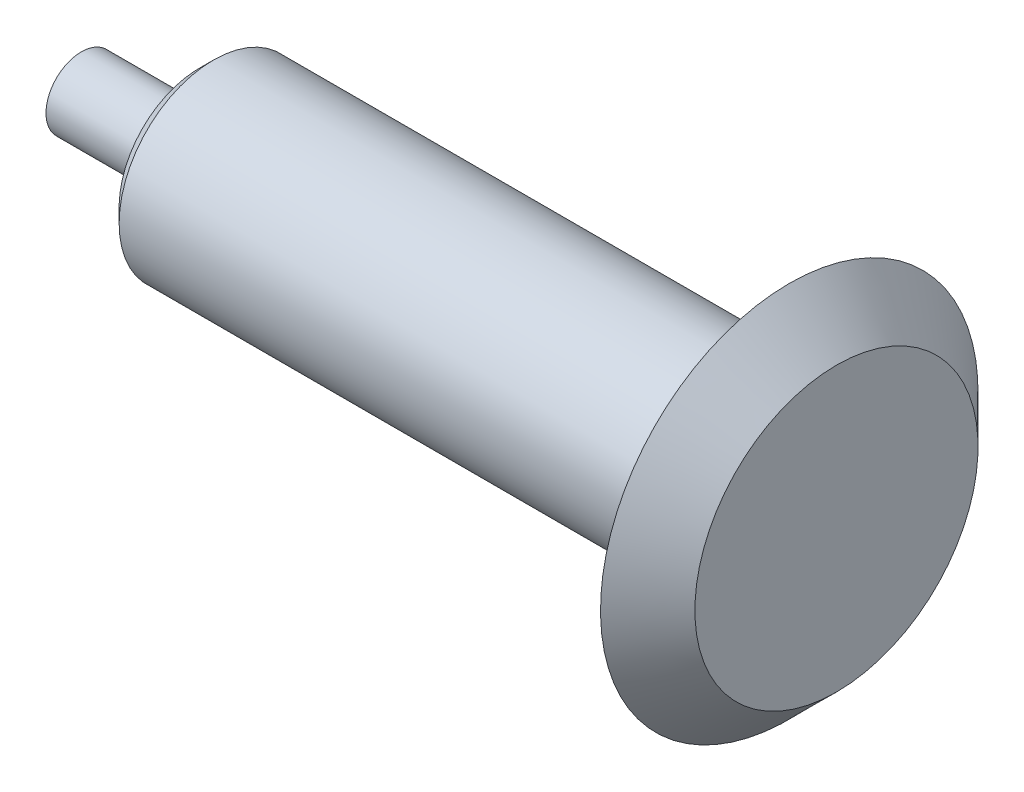
ISO-10303-21;
HEADER;
FILE_DESCRIPTION(('STEP AP214'),'2;1');
FILE_NAME('part.step','',(''),(''),'','','');
FILE_SCHEMA(('AUTOMOTIVE_DESIGN { 1 0 10303 214 1 1 1 1 }'));
ENDSEC;
DATA;
#1=APPLICATION_CONTEXT('core data for automotive mechanical design processes');
#2=APPLICATION_PROTOCOL_DEFINITION('international standard','automotive_design',2000,#1);
#3=PRODUCT_CONTEXT('',#1,'mechanical');
#4=PRODUCT('Part','Part','',(#3));
#5=PRODUCT_RELATED_PRODUCT_CATEGORY('part','',(#4));
#6=PRODUCT_DEFINITION_FORMATION('','',#4);
#7=PRODUCT_DEFINITION_CONTEXT('part definition',#1,'design');
#8=PRODUCT_DEFINITION('design','',#6,#7);
#9=PRODUCT_DEFINITION_SHAPE('','',#8);
#10=(LENGTH_UNIT() NAMED_UNIT(*) SI_UNIT(.MILLI.,.METRE.));
#11=(NAMED_UNIT(*) PLANE_ANGLE_UNIT() SI_UNIT($,.RADIAN.));
#12=(NAMED_UNIT(*) SI_UNIT($,.STERADIAN.) SOLID_ANGLE_UNIT());
#13=UNCERTAINTY_MEASURE_WITH_UNIT(LENGTH_MEASURE(1.E-05),#10,'distance_accuracy_value','');
#14=(GEOMETRIC_REPRESENTATION_CONTEXT(3) GLOBAL_UNCERTAINTY_ASSIGNED_CONTEXT((#13)) GLOBAL_UNIT_ASSIGNED_CONTEXT((#10,
#11,#12)) REPRESENTATION_CONTEXT('',''));
#15=CARTESIAN_POINT('',(0.,0.,0.));
#16=DIRECTION('',(0.,0.,1.));
#17=DIRECTION('',(1.,0.,0.));
#18=AXIS2_PLACEMENT_3D('',#15,#16,#17);
#19=CARTESIAN_POINT('',(-80.,0.,0.));
#20=DIRECTION('',(-1.,0.,0.));
#21=DIRECTION('',(0.,-1.,0.));
#22=AXIS2_PLACEMENT_3D('',#19,#20,#21);
#23=PLANE('',#22);
#24=CARTESIAN_POINT('',(-80.,0.,0.));
#25=DIRECTION('',(1.,0.,0.));
#26=DIRECTION('',(0.,1.,0.));
#27=AXIS2_PLACEMENT_3D('',#24,#25,#26);
#28=CIRCLE('',#27,7.5);
#29=CARTESIAN_POINT('',(-80.,7.49999999999998,0.));
#30=VERTEX_POINT('',#29);
#31=EDGE_CURVE('E53',#30,#30,#28,.T.);
#32=ORIENTED_EDGE('',*,*,#31,.F.);
#33=EDGE_LOOP('',(#32));
#34=FACE_BOUND('',#33,.T.);
#35=ADVANCED_FACE('F37',(#34),#23,.T.);
#36=CARTESIAN_POINT('',(80.,0.,0.));
#37=DIRECTION('',(1.,0.,0.));
#38=DIRECTION('',(0.,1.,0.));
#39=AXIS2_PLACEMENT_3D('',#36,#37,#38);
#40=CYLINDRICAL_SURFACE('',#39,7.5);
#41=ORIENTED_EDGE('',*,*,#31,.T.);
#42=EDGE_LOOP('',(#41));
#43=FACE_BOUND('',#42,.T.);
#44=CARTESIAN_POINT('',(-55.,0.,0.));
#45=DIRECTION('',(1.,0.,0.));
#46=DIRECTION('',(0.,1.,0.));
#47=AXIS2_PLACEMENT_3D('',#44,#45,#46);
#48=CIRCLE('',#47,7.49999999999999);
#49=CARTESIAN_POINT('',(-55.,7.49999999999998,0.));
#50=VERTEX_POINT('',#49);
#51=EDGE_CURVE('E58',#50,#50,#48,.T.);
#52=ORIENTED_EDGE('',*,*,#51,.F.);
#53=EDGE_LOOP('',(#52));
#54=FACE_BOUND('',#53,.T.);
#55=ADVANCED_FACE('F90',(#43,#54),#40,.T.);
#56=CARTESIAN_POINT('',(-55.,7.49999999999998,0.));
#57=DIRECTION('',(-1.,0.,0.));
#58=DIRECTION('',(0.,-1.,0.));
#59=AXIS2_PLACEMENT_3D('',#56,#57,#58);
#60=PLANE('',#59);
#61=CARTESIAN_POINT('',(-55.,0.,0.));
#62=DIRECTION('',(-1.,0.,0.));
#63=DIRECTION('',(0.,-1.,0.));
#64=AXIS2_PLACEMENT_3D('',#61,#62,#63);
#65=CIRCLE('',#64,16.9999999999999);
#66=CARTESIAN_POINT('',(-55.,-17.,0.));
#67=VERTEX_POINT('',#66);
#68=EDGE_CURVE('E10',#67,#67,#65,.T.);
#69=ORIENTED_EDGE('',*,*,#68,.T.);
#70=EDGE_LOOP('',(#69));
#71=FACE_BOUND('',#70,.T.);
#72=ORIENTED_EDGE('',*,*,#51,.T.);
#73=EDGE_LOOP('',(#72));
#74=FACE_BOUND('',#73,.T.);
#75=ADVANCED_FACE('F96',(#71,#74),#60,.T.);
#76=CARTESIAN_POINT('',(80.,0.,0.));
#77=DIRECTION('',(1.,0.,0.));
#78=DIRECTION('',(0.,1.,0.));
#79=AXIS2_PLACEMENT_3D('',#76,#77,#78);
#80=CYLINDRICAL_SURFACE('',#79,20.);
#81=CARTESIAN_POINT('',(-52.,0.,0.));
#82=DIRECTION('',(-1.,0.,0.));
#83=DIRECTION('',(0.,-1.,0.));
#84=AXIS2_PLACEMENT_3D('',#81,#82,#83);
#85=CIRCLE('',#84,20.);
#86=CARTESIAN_POINT('',(-52.,-20.,0.));
#87=VERTEX_POINT('',#86);
#88=EDGE_CURVE('E45',#87,#87,#85,.F.);
#89=ORIENTED_EDGE('',*,*,#88,.T.);
#90=EDGE_LOOP('',(#89));
#91=FACE_BOUND('',#90,.T.);
#92=CARTESIAN_POINT('',(62.9289321881345,0.,0.));
#93=DIRECTION('',(1.,0.,0.));
#94=DIRECTION('',(0.,1.,0.));
#95=AXIS2_PLACEMENT_3D('',#92,#93,#94);
#96=CIRCLE('',#95,20.);
#97=CARTESIAN_POINT('',(62.9289321881345,20.,0.));
#98=VERTEX_POINT('',#97);
#99=EDGE_CURVE('E61',#98,#98,#96,.T.);
#100=ORIENTED_EDGE('',*,*,#99,.F.);
#101=EDGE_LOOP('',(#100));
#102=FACE_BOUND('',#101,.T.);
#103=ADVANCED_FACE('F86',(#91,#102),#80,.T.);
#104=CARTESIAN_POINT('',(70.,0.,0.));
#105=DIRECTION('',(1.,0.,0.));
#106=DIRECTION('',(0.,1.,0.));
#107=AXIS2_PLACEMENT_3D('',#104,#105,#106);
#108=CONICAL_SURFACE('',#107,27.0710678118655,0.78539816339745);
#109=ORIENTED_EDGE('',*,*,#99,.T.);
#110=EDGE_LOOP('',(#109));
#111=FACE_BOUND('',#110,.T.);
#112=CARTESIAN_POINT('',(70.,0.,0.));
#113=DIRECTION('',(1.,0.,0.));
#114=DIRECTION('',(0.,1.,0.));
#115=AXIS2_PLACEMENT_3D('',#112,#113,#114);
#116=CIRCLE('',#115,27.0710678118655);
#117=CARTESIAN_POINT('',(70.,27.0710678118655,0.));
#118=VERTEX_POINT('',#117);
#119=EDGE_CURVE('E64',#118,#118,#116,.T.);
#120=ORIENTED_EDGE('',*,*,#119,.F.);
#121=EDGE_LOOP('',(#120));
#122=FACE_BOUND('',#121,.T.);
#123=ADVANCED_FACE('F77',(#111,#122),#108,.T.);
#124=CARTESIAN_POINT('',(70.,27.0710678118655,0.));
#125=DIRECTION('',(-1.,0.,0.));
#126=DIRECTION('',(0.,-1.,0.));
#127=AXIS2_PLACEMENT_3D('',#124,#125,#126);
#128=PLANE('',#127);
#129=ORIENTED_EDGE('',*,*,#119,.T.);
#130=EDGE_LOOP('',(#129));
#131=FACE_BOUND('',#130,.T.);
#132=CARTESIAN_POINT('',(70.,0.,0.));
#133=DIRECTION('',(1.,0.,0.));
#134=DIRECTION('',(0.,1.,0.));
#135=AXIS2_PLACEMENT_3D('',#132,#133,#134);
#136=CIRCLE('',#135,40.);
#137=CARTESIAN_POINT('',(70.,40.,0.));
#138=VERTEX_POINT('',#137);
#139=EDGE_CURVE('E67',#138,#138,#136,.T.);
#140=ORIENTED_EDGE('',*,*,#139,.F.);
#141=EDGE_LOOP('',(#140));
#142=FACE_BOUND('',#141,.T.);
#143=ADVANCED_FACE('F74',(#131,#142),#128,.T.);
#144=CARTESIAN_POINT('',(80.,40.,0.));
#145=DIRECTION('',(1.,0.,0.));
#146=DIRECTION('',(0.,1.,0.));
#147=AXIS2_PLACEMENT_3D('',#144,#145,#146);
#148=PLANE('',#147);
#149=CARTESIAN_POINT('',(80.,0.,0.));
#150=DIRECTION('',(1.,0.,0.));
#151=DIRECTION('',(0.,1.,0.));
#152=AXIS2_PLACEMENT_3D('',#149,#150,#151);
#153=CIRCLE('',#152,30.0000000000001);
#154=CARTESIAN_POINT('',(80.,30.0000000000001,0.));
#155=VERTEX_POINT('',#154);
#156=EDGE_CURVE('E49',#155,#155,#153,.T.);
#157=ORIENTED_EDGE('',*,*,#156,.T.);
#158=EDGE_LOOP('',(#157));
#159=FACE_BOUND('',#158,.T.);
#160=ADVANCED_FACE('F76',(#159),#148,.T.);
#161=CARTESIAN_POINT('',(80.,0.,0.));
#162=DIRECTION('',(-1.,0.,0.));
#163=DIRECTION('',(0.,-1.,0.));
#164=AXIS2_PLACEMENT_3D('',#161,#162,#163);
#165=CONICAL_SURFACE('',#164,30.0000000000001,0.785398163397448);
#166=ORIENTED_EDGE('',*,*,#139,.T.);
#167=EDGE_LOOP('',(#166));
#168=FACE_BOUND('',#167,.T.);
#169=ORIENTED_EDGE('',*,*,#156,.F.);
#170=EDGE_LOOP('',(#169));
#171=FACE_BOUND('',#170,.T.);
#172=ADVANCED_FACE('F71',(#168,#171),#165,.T.);
#173=CARTESIAN_POINT('',(-52.,0.,0.));
#174=DIRECTION('',(1.,0.,0.));
#175=DIRECTION('',(0.,1.,0.));
#176=AXIS2_PLACEMENT_3D('',#173,#174,#175);
#177=CONICAL_SURFACE('',#176,20.,0.785398163397455);
#178=ORIENTED_EDGE('',*,*,#68,.F.);
#179=EDGE_LOOP('',(#178));
#180=FACE_BOUND('',#179,.T.);
#181=ORIENTED_EDGE('',*,*,#88,.F.);
#182=EDGE_LOOP('',(#181));
#183=FACE_BOUND('',#182,.T.);
#184=ADVANCED_FACE('F40',(#180,#183),#177,.T.);
#185=CLOSED_SHELL('',(#35,#55,#75,#103,#123,#143,#160,#172,#184));
#186=MANIFOLD_SOLID_BREP('B2',#185);
#187=ADVANCED_BREP_SHAPE_REPRESENTATION('',(#18,#186),#14);
#188=SHAPE_DEFINITION_REPRESENTATION(#9,#187);
ENDSEC;
END-ISO-10303-21;
